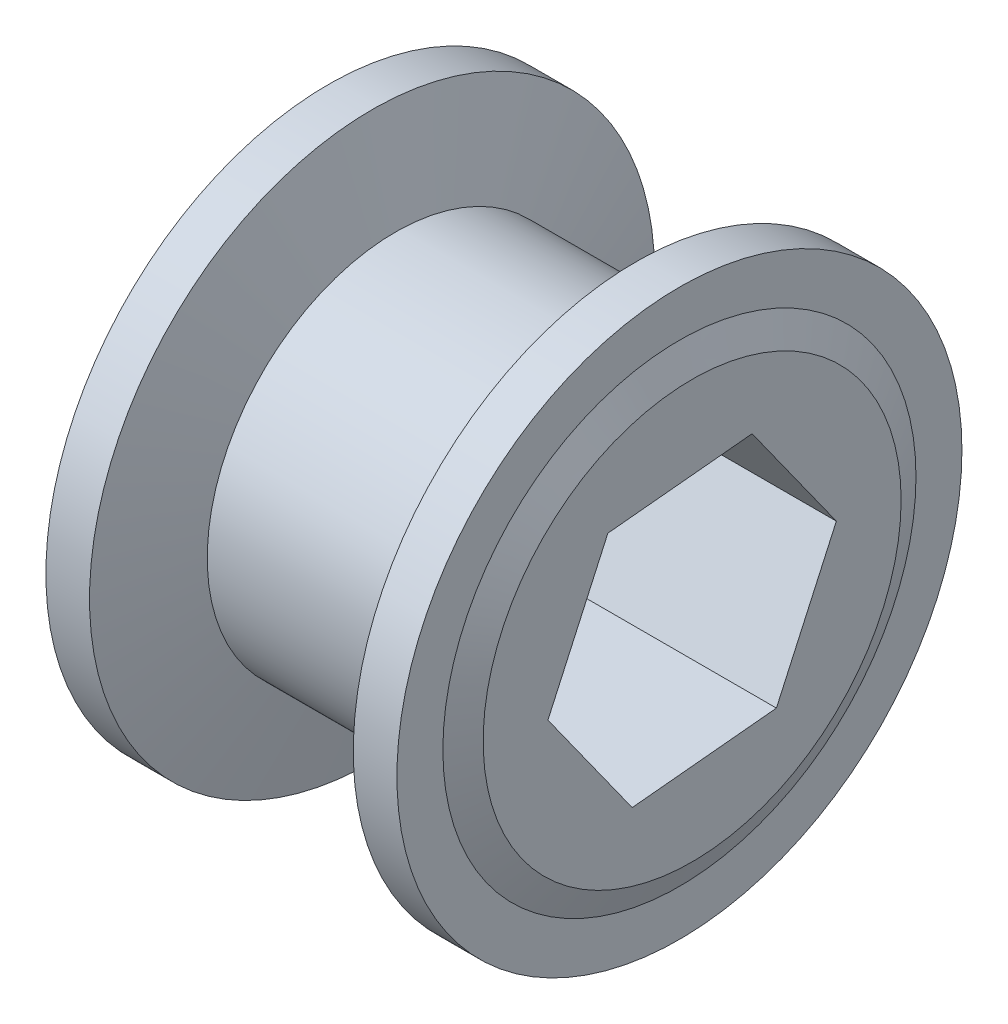
ISO-10303-21;
HEADER;
FILE_DESCRIPTION(('STEP AP214'),'2;1');
FILE_NAME('part.step','',(''),(''),'','','');
FILE_SCHEMA(('AUTOMOTIVE_DESIGN { 1 0 10303 214 1 1 1 1 }'));
ENDSEC;
DATA;
#1=APPLICATION_CONTEXT('core data for automotive mechanical design processes');
#2=APPLICATION_PROTOCOL_DEFINITION('international standard','automotive_design',2000,#1);
#3=PRODUCT_CONTEXT('',#1,'mechanical');
#4=PRODUCT('Part','Part','',(#3));
#5=PRODUCT_RELATED_PRODUCT_CATEGORY('part','',(#4));
#6=PRODUCT_DEFINITION_FORMATION('','',#4);
#7=PRODUCT_DEFINITION_CONTEXT('part definition',#1,'design');
#8=PRODUCT_DEFINITION('design','',#6,#7);
#9=PRODUCT_DEFINITION_SHAPE('','',#8);
#10=(LENGTH_UNIT() NAMED_UNIT(*) SI_UNIT(.MILLI.,.METRE.));
#11=(NAMED_UNIT(*) PLANE_ANGLE_UNIT() SI_UNIT($,.RADIAN.));
#12=(NAMED_UNIT(*) SI_UNIT($,.STERADIAN.) SOLID_ANGLE_UNIT());
#13=UNCERTAINTY_MEASURE_WITH_UNIT(LENGTH_MEASURE(1.E-05),#10,'distance_accuracy_value','');
#14=(GEOMETRIC_REPRESENTATION_CONTEXT(3) GLOBAL_UNCERTAINTY_ASSIGNED_CONTEXT((#13)) GLOBAL_UNIT_ASSIGNED_CONTEXT((#10,
#11,#12)) REPRESENTATION_CONTEXT('',''));
#15=CARTESIAN_POINT('',(0.,0.,0.));
#16=DIRECTION('',(0.,0.,1.));
#17=DIRECTION('',(1.,0.,0.));
#18=AXIS2_PLACEMENT_3D('',#15,#16,#17);
#19=CARTESIAN_POINT('',(14.1606713050093,0.,0.));
#20=DIRECTION('',(1.,0.,0.));
#21=DIRECTION('',(0.,0.,-1.));
#22=AXIS2_PLACEMENT_3D('',#19,#20,#21);
#23=CYLINDRICAL_SURFACE('',#22,9.525);
#24=CARTESIAN_POINT('',(5.48780048814024,0.,0.));
#25=DIRECTION('',(1.,0.,0.));
#26=DIRECTION('',(0.,0.,-1.));
#27=AXIS2_PLACEMENT_3D('',#24,#25,#26);
#28=CIRCLE('',#27,9.525);
#29=CARTESIAN_POINT('',(5.48780048814024,0.,-9.525));
#30=VERTEX_POINT('',#29);
#31=EDGE_CURVE('E132',#30,#30,#28,.T.);
#32=ORIENTED_EDGE('',*,*,#31,.F.);
#33=EDGE_LOOP('',(#32));
#34=FACE_BOUND('',#33,.T.);
#35=CARTESIAN_POINT('',(-5.48780048814024,0.,0.));
#36=DIRECTION('',(1.,0.,0.));
#37=DIRECTION('',(0.,0.,-1.));
#38=AXIS2_PLACEMENT_3D('',#35,#36,#37);
#39=CIRCLE('',#38,9.525);
#40=CARTESIAN_POINT('',(-5.48780048814024,0.,-9.525));
#41=VERTEX_POINT('',#40);
#42=EDGE_CURVE('E11',#41,#41,#39,.T.);
#43=ORIENTED_EDGE('',*,*,#42,.T.);
#44=EDGE_LOOP('',(#43));
#45=FACE_BOUND('',#44,.T.);
#46=ADVANCED_FACE('F35',(#34,#45),#23,.T.);
#47=CARTESIAN_POINT('',(-5.48780048814024,0.,0.));
#48=DIRECTION('',(-1.,0.,0.));
#49=DIRECTION('',(0.,0.,1.));
#50=AXIS2_PLACEMENT_3D('',#47,#48,#49);
#51=CONICAL_SURFACE('',#50,9.525,1.32724902649702);
#52=CARTESIAN_POINT('',(-6.6734296232301,0.,0.));
#53=DIRECTION('',(1.,0.,0.));
#54=DIRECTION('',(0.,0.,-1.));
#55=AXIS2_PLACEMENT_3D('',#52,#53,#54);
#56=CIRCLE('',#55,14.2965328044227);
#57=CARTESIAN_POINT('',(-6.6734296232301,0.,-14.2965328044227));
#58=VERTEX_POINT('',#57);
#59=EDGE_CURVE('E42',#58,#58,#56,.T.);
#60=ORIENTED_EDGE('',*,*,#59,.T.);
#61=EDGE_LOOP('',(#60));
#62=FACE_BOUND('',#61,.T.);
#63=ORIENTED_EDGE('',*,*,#42,.F.);
#64=EDGE_LOOP('',(#63));
#65=FACE_BOUND('',#64,.T.);
#66=ADVANCED_FACE('F165',(#62,#65),#51,.T.);
#67=CARTESIAN_POINT('',(14.1606713050093,0.,0.));
#68=DIRECTION('',(1.,0.,0.));
#69=DIRECTION('',(0.,0.,-1.));
#70=AXIS2_PLACEMENT_3D('',#67,#68,#69);
#71=CYLINDRICAL_SURFACE('',#70,14.2965328044227);
#72=CARTESIAN_POINT('',(-8.88177466157458,0.,0.));
#73=DIRECTION('',(1.,0.,0.));
#74=DIRECTION('',(0.,0.,-1.));
#75=AXIS2_PLACEMENT_3D('',#72,#73,#74);
#76=CIRCLE('',#75,14.2965328044227);
#77=CARTESIAN_POINT('',(-8.88177466157458,0.,-14.2965328044227));
#78=VERTEX_POINT('',#77);
#79=EDGE_CURVE('E160',#78,#78,#76,.T.);
#80=ORIENTED_EDGE('',*,*,#79,.T.);
#81=EDGE_LOOP('',(#80));
#82=FACE_BOUND('',#81,.T.);
#83=ORIENTED_EDGE('',*,*,#59,.F.);
#84=EDGE_LOOP('',(#83));
#85=FACE_BOUND('',#84,.T.);
#86=ADVANCED_FACE('F168',(#82,#85),#71,.T.);
#87=CARTESIAN_POINT('',(-8.88177466157458,0.,0.));
#88=DIRECTION('',(-1.,0.,0.));
#89=DIRECTION('',(0.,0.,1.));
#90=AXIS2_PLACEMENT_3D('',#87,#88,#89);
#91=PLANE('',#90);
#92=CARTESIAN_POINT('',(-8.88177466157458,0.,0.));
#93=DIRECTION('',(1.,0.,0.));
#94=DIRECTION('',(0.,0.,-1.));
#95=AXIS2_PLACEMENT_3D('',#92,#93,#94);
#96=CIRCLE('',#95,11.9707329902199);
#97=CARTESIAN_POINT('',(-8.88177466157458,0.,-11.9707329902199));
#98=VERTEX_POINT('',#97);
#99=EDGE_CURVE('E157',#98,#98,#96,.T.);
#100=ORIENTED_EDGE('',*,*,#99,.T.);
#101=EDGE_LOOP('',(#100));
#102=FACE_BOUND('',#101,.T.);
#103=ORIENTED_EDGE('',*,*,#79,.F.);
#104=EDGE_LOOP('',(#103));
#105=FACE_BOUND('',#104,.T.);
#106=ADVANCED_FACE('F170',(#102,#105),#91,.T.);
#107=CARTESIAN_POINT('',(-8.88177466157458,0.,0.));
#108=DIRECTION('',(1.,0.,0.));
#109=DIRECTION('',(0.,0.,-1.));
#110=AXIS2_PLACEMENT_3D('',#107,#108,#109);
#111=CONICAL_SURFACE('',#110,11.9707329902199,1.13884824811822);
#112=CARTESIAN_POINT('',(-9.525,0.,0.));
#113=DIRECTION('',(1.,0.,0.));
#114=DIRECTION('',(0.,0.,-1.));
#115=AXIS2_PLACEMENT_3D('',#112,#113,#114);
#116=CIRCLE('',#115,10.5753926286241);
#117=CARTESIAN_POINT('',(-9.525,0.,-10.5753926286241));
#118=VERTEX_POINT('',#117);
#119=EDGE_CURVE('E154',#118,#118,#116,.T.);
#120=ORIENTED_EDGE('',*,*,#119,.T.);
#121=EDGE_LOOP('',(#120));
#122=FACE_BOUND('',#121,.T.);
#123=ORIENTED_EDGE('',*,*,#99,.F.);
#124=EDGE_LOOP('',(#123));
#125=FACE_BOUND('',#124,.T.);
#126=ADVANCED_FACE('F177',(#122,#125),#111,.T.);
#127=CARTESIAN_POINT('',(-9.525,0.,0.));
#128=DIRECTION('',(-1.,0.,0.));
#129=DIRECTION('',(0.,0.,1.));
#130=AXIS2_PLACEMENT_3D('',#127,#128,#129);
#131=PLANE('',#130);
#132=DIRECTION('',(0.,0.0969196765193693,-0.995292206491833));
#133=VECTOR('',#132,1.);
#134=CARTESIAN_POINT('',(-9.525,-6.67542992965739,3.03347467231352));
#135=LINE('',#134,#133);
#136=CARTESIAN_POINT('',(-9.525,-6.67542992965739,3.03347467231352));
#137=VERTEX_POINT('',#136);
#138=CARTESIAN_POINT('',(-9.525,-5.96478109278888,-4.26435456410951));
#139=VERTEX_POINT('',#138);
#140=EDGE_CURVE('E89',#137,#139,#135,.T.);
#141=ORIENTED_EDGE('',*,*,#140,.T.);
#142=DIRECTION('',(0.,0.910408173270279,-0.413711201253572));
#143=VECTOR('',#142,1.);
#144=CARTESIAN_POINT('',(-9.525,-5.96478109278888,-4.26435456410951));
#145=LINE('',#144,#143);
#146=CARTESIAN_POINT('',(-9.525,0.710648836868518,-7.29782923642303));
#147=VERTEX_POINT('',#146);
#148=EDGE_CURVE('E98',#139,#147,#145,.T.);
#149=ORIENTED_EDGE('',*,*,#148,.T.);
#150=DIRECTION('',(0.,0.81348849675091,0.58158100523826));
#151=VECTOR('',#150,1.);
#152=CARTESIAN_POINT('',(-9.525,0.710648836868518,-7.29782923642303));
#153=LINE('',#152,#151);
#154=CARTESIAN_POINT('',(-9.525,6.6754299296574,-3.03347467231352));
#155=VERTEX_POINT('',#154);
#156=EDGE_CURVE('E49',#147,#155,#153,.T.);
#157=ORIENTED_EDGE('',*,*,#156,.T.);
#158=DIRECTION('',(0.,-0.0969196765193695,0.995292206491833));
#159=VECTOR('',#158,1.);
#160=CARTESIAN_POINT('',(-9.525,6.6754299296574,-3.03347467231352));
#161=LINE('',#160,#159);
#162=CARTESIAN_POINT('',(-9.525,5.96478109278888,4.26435456410951));
#163=VERTEX_POINT('',#162);
#164=EDGE_CURVE('E113',#155,#163,#161,.T.);
#165=ORIENTED_EDGE('',*,*,#164,.T.);
#166=DIRECTION('',(0.,-0.910408173270279,0.413711201253572));
#167=VECTOR('',#166,1.);
#168=CARTESIAN_POINT('',(-9.525,5.96478109278888,4.26435456410951));
#169=LINE('',#168,#167);
#170=CARTESIAN_POINT('',(-9.525,-0.710648836868512,7.29782923642303));
#171=VERTEX_POINT('',#170);
#172=EDGE_CURVE('E116',#163,#171,#169,.T.);
#173=ORIENTED_EDGE('',*,*,#172,.T.);
#174=DIRECTION('',(0.,-0.81348849675091,-0.58158100523826));
#175=VECTOR('',#174,1.);
#176=CARTESIAN_POINT('',(-9.525,-0.710648836868512,7.29782923642303));
#177=LINE('',#176,#175);
#178=EDGE_CURVE('E95',#171,#137,#177,.T.);
#179=ORIENTED_EDGE('',*,*,#178,.T.);
#180=EDGE_LOOP('',(#141,#149,#157,#165,#173,#179));
#181=FACE_BOUND('',#180,.T.);
#182=ORIENTED_EDGE('',*,*,#119,.F.);
#183=EDGE_LOOP('',(#182));
#184=FACE_BOUND('',#183,.T.);
#185=ADVANCED_FACE('F102',(#181,#184),#131,.T.);
#186=CARTESIAN_POINT('',(9.525,0.,0.));
#187=DIRECTION('',(-1.,0.,0.));
#188=DIRECTION('',(0.,0.,1.));
#189=AXIS2_PLACEMENT_3D('',#186,#187,#188);
#190=PLANE('',#189);
#191=DIRECTION('',(0.,0.910408173270279,-0.413711201253572));
#192=VECTOR('',#191,1.);
#193=CARTESIAN_POINT('',(9.525,-5.96478109278888,-4.26435456410951));
#194=LINE('',#193,#192);
#195=CARTESIAN_POINT('',(9.525,-5.96478109278888,-4.26435456410951));
#196=VERTEX_POINT('',#195);
#197=CARTESIAN_POINT('',(9.525,0.710648836868518,-7.29782923642303));
#198=VERTEX_POINT('',#197);
#199=EDGE_CURVE('E120',#196,#198,#194,.T.);
#200=ORIENTED_EDGE('',*,*,#199,.F.);
#201=DIRECTION('',(0.,0.0969196765193693,-0.995292206491833));
#202=VECTOR('',#201,1.);
#203=CARTESIAN_POINT('',(9.525,-6.67542992965739,3.03347467231352));
#204=LINE('',#203,#202);
#205=CARTESIAN_POINT('',(9.525,-6.67542992965739,3.03347467231352));
#206=VERTEX_POINT('',#205);
#207=EDGE_CURVE('E57',#206,#196,#204,.T.);
#208=ORIENTED_EDGE('',*,*,#207,.F.);
#209=DIRECTION('',(0.,-0.81348849675091,-0.58158100523826));
#210=VECTOR('',#209,1.);
#211=CARTESIAN_POINT('',(9.525,-0.710648836868512,7.29782923642303));
#212=LINE('',#211,#210);
#213=CARTESIAN_POINT('',(9.525,-0.710648836868512,7.29782923642303));
#214=VERTEX_POINT('',#213);
#215=EDGE_CURVE('E106',#214,#206,#212,.T.);
#216=ORIENTED_EDGE('',*,*,#215,.F.);
#217=DIRECTION('',(0.,-0.910408173270279,0.413711201253572));
#218=VECTOR('',#217,1.);
#219=CARTESIAN_POINT('',(9.525,5.96478109278888,4.26435456410951));
#220=LINE('',#219,#218);
#221=CARTESIAN_POINT('',(9.525,5.96478109278888,4.26435456410951));
#222=VERTEX_POINT('',#221);
#223=EDGE_CURVE('E109',#222,#214,#220,.T.);
#224=ORIENTED_EDGE('',*,*,#223,.F.);
#225=DIRECTION('',(0.,-0.0969196765193695,0.995292206491833));
#226=VECTOR('',#225,1.);
#227=CARTESIAN_POINT('',(9.525,6.6754299296574,-3.03347467231352));
#228=LINE('',#227,#226);
#229=CARTESIAN_POINT('',(9.525,6.6754299296574,-3.03347467231352));
#230=VERTEX_POINT('',#229);
#231=EDGE_CURVE('E125',#230,#222,#228,.T.);
#232=ORIENTED_EDGE('',*,*,#231,.F.);
#233=DIRECTION('',(0.,0.81348849675091,0.58158100523826));
#234=VECTOR('',#233,1.);
#235=CARTESIAN_POINT('',(9.525,0.710648836868518,-7.29782923642303));
#236=LINE('',#235,#234);
#237=EDGE_CURVE('E122',#198,#230,#236,.T.);
#238=ORIENTED_EDGE('',*,*,#237,.F.);
#239=EDGE_LOOP('',(#200,#208,#216,#224,#232,#238));
#240=FACE_BOUND('',#239,.T.);
#241=CARTESIAN_POINT('',(9.525,0.,0.));
#242=DIRECTION('',(1.,0.,0.));
#243=DIRECTION('',(0.,0.,-1.));
#244=AXIS2_PLACEMENT_3D('',#241,#242,#243);
#245=CIRCLE('',#244,10.5753926286241);
#246=CARTESIAN_POINT('',(9.525,0.,-10.5753926286241));
#247=VERTEX_POINT('',#246);
#248=EDGE_CURVE('E151',#247,#247,#245,.T.);
#249=ORIENTED_EDGE('',*,*,#248,.T.);
#250=EDGE_LOOP('',(#249));
#251=FACE_BOUND('',#250,.T.);
#252=ADVANCED_FACE('F211',(#240,#251),#190,.F.);
#253=CARTESIAN_POINT('',(8.88177466157458,0.,0.));
#254=DIRECTION('',(-1.,0.,0.));
#255=DIRECTION('',(0.,0.,1.));
#256=AXIS2_PLACEMENT_3D('',#253,#254,#255);
#257=CONICAL_SURFACE('',#256,11.9707329902199,1.13884824811822);
#258=ORIENTED_EDGE('',*,*,#248,.F.);
#259=EDGE_LOOP('',(#258));
#260=FACE_BOUND('',#259,.T.);
#261=CARTESIAN_POINT('',(8.88177466157458,0.,0.));
#262=DIRECTION('',(1.,0.,0.));
#263=DIRECTION('',(0.,0.,-1.));
#264=AXIS2_PLACEMENT_3D('',#261,#262,#263);
#265=CIRCLE('',#264,11.9707329902199);
#266=CARTESIAN_POINT('',(8.88177466157458,0.,-11.9707329902199));
#267=VERTEX_POINT('',#266);
#268=EDGE_CURVE('E148',#267,#267,#265,.T.);
#269=ORIENTED_EDGE('',*,*,#268,.T.);
#270=EDGE_LOOP('',(#269));
#271=FACE_BOUND('',#270,.T.);
#272=ADVANCED_FACE('F207',(#260,#271),#257,.T.);
#273=CARTESIAN_POINT('',(8.88177466157458,0.,0.));
#274=DIRECTION('',(-1.,0.,0.));
#275=DIRECTION('',(0.,0.,1.));
#276=AXIS2_PLACEMENT_3D('',#273,#274,#275);
#277=PLANE('',#276);
#278=ORIENTED_EDGE('',*,*,#268,.F.);
#279=EDGE_LOOP('',(#278));
#280=FACE_BOUND('',#279,.T.);
#281=CARTESIAN_POINT('',(8.88177466157458,0.,0.));
#282=DIRECTION('',(1.,0.,0.));
#283=DIRECTION('',(0.,0.,-1.));
#284=AXIS2_PLACEMENT_3D('',#281,#282,#283);
#285=CIRCLE('',#284,14.2965328044227);
#286=CARTESIAN_POINT('',(8.88177466157458,0.,-14.2965328044227));
#287=VERTEX_POINT('',#286);
#288=EDGE_CURVE('E145',#287,#287,#285,.T.);
#289=ORIENTED_EDGE('',*,*,#288,.T.);
#290=EDGE_LOOP('',(#289));
#291=FACE_BOUND('',#290,.T.);
#292=ADVANCED_FACE('F199',(#280,#291),#277,.F.);
#293=CARTESIAN_POINT('',(14.1606713050093,0.,0.));
#294=DIRECTION('',(1.,0.,0.));
#295=DIRECTION('',(0.,0.,-1.));
#296=AXIS2_PLACEMENT_3D('',#293,#294,#295);
#297=CYLINDRICAL_SURFACE('',#296,14.2965328044227);
#298=ORIENTED_EDGE('',*,*,#288,.F.);
#299=EDGE_LOOP('',(#298));
#300=FACE_BOUND('',#299,.T.);
#301=CARTESIAN_POINT('',(6.6734296232301,0.,0.));
#302=DIRECTION('',(1.,0.,0.));
#303=DIRECTION('',(0.,0.,-1.));
#304=AXIS2_PLACEMENT_3D('',#301,#302,#303);
#305=CIRCLE('',#304,14.2965328044227);
#306=CARTESIAN_POINT('',(6.6734296232301,0.,-14.2965328044227));
#307=VERTEX_POINT('',#306);
#308=EDGE_CURVE('E142',#307,#307,#305,.T.);
#309=ORIENTED_EDGE('',*,*,#308,.T.);
#310=EDGE_LOOP('',(#309));
#311=FACE_BOUND('',#310,.T.);
#312=ADVANCED_FACE('F190',(#300,#311),#297,.T.);
#313=CARTESIAN_POINT('',(5.48780048814024,0.,0.));
#314=DIRECTION('',(1.,0.,0.));
#315=DIRECTION('',(0.,0.,-1.));
#316=AXIS2_PLACEMENT_3D('',#313,#314,#315);
#317=CONICAL_SURFACE('',#316,9.525,1.32724902649702);
#318=ORIENTED_EDGE('',*,*,#308,.F.);
#319=EDGE_LOOP('',(#318));
#320=FACE_BOUND('',#319,.T.);
#321=ORIENTED_EDGE('',*,*,#31,.T.);
#322=EDGE_LOOP('',(#321));
#323=FACE_BOUND('',#322,.T.);
#324=ADVANCED_FACE('F188',(#320,#323),#317,.T.);
#325=CARTESIAN_POINT('',(-9.525,-6.67542992965739,3.03347467231352));
#326=DIRECTION('',(0.,-0.995292206491833,-0.0969196765193693));
#327=DIRECTION('',(0.,0.0969196765193693,-0.995292206491833));
#328=AXIS2_PLACEMENT_3D('',#325,#326,#327);
#329=PLANE('',#328);
#330=ORIENTED_EDGE('',*,*,#207,.T.);
#331=DIRECTION('',(1.,0.,0.));
#332=VECTOR('',#331,1.);
#333=CARTESIAN_POINT('',(-9.525,-5.96478109278888,-4.26435456410951));
#334=LINE('',#333,#332);
#335=EDGE_CURVE('E85',#139,#196,#334,.T.);
#336=ORIENTED_EDGE('',*,*,#335,.F.);
#337=ORIENTED_EDGE('',*,*,#140,.F.);
#338=DIRECTION('',(1.,0.,0.));
#339=VECTOR('',#338,1.);
#340=CARTESIAN_POINT('',(-9.525,-6.67542992965739,3.03347467231352));
#341=LINE('',#340,#339);
#342=EDGE_CURVE('E130',#137,#206,#341,.T.);
#343=ORIENTED_EDGE('',*,*,#342,.T.);
#344=EDGE_LOOP('',(#330,#336,#337,#343));
#345=FACE_BOUND('',#344,.T.);
#346=ADVANCED_FACE('F87',(#345),#329,.F.);
#347=CARTESIAN_POINT('',(-9.525,-0.710648836868512,7.29782923642303));
#348=DIRECTION('',(0.,-0.58158100523826,0.81348849675091));
#349=DIRECTION('',(0.,-0.81348849675091,-0.58158100523826));
#350=AXIS2_PLACEMENT_3D('',#347,#348,#349);
#351=PLANE('',#350);
#352=ORIENTED_EDGE('',*,*,#215,.T.);
#353=ORIENTED_EDGE('',*,*,#342,.F.);
#354=ORIENTED_EDGE('',*,*,#178,.F.);
#355=DIRECTION('',(1.,0.,0.));
#356=VECTOR('',#355,1.);
#357=CARTESIAN_POINT('',(-9.525,-0.710648836868512,7.29782923642303));
#358=LINE('',#357,#356);
#359=EDGE_CURVE('E133',#171,#214,#358,.T.);
#360=ORIENTED_EDGE('',*,*,#359,.T.);
#361=EDGE_LOOP('',(#352,#353,#354,#360));
#362=FACE_BOUND('',#361,.T.);
#363=ADVANCED_FACE('F197',(#362),#351,.F.);
#364=CARTESIAN_POINT('',(-9.525,5.96478109278888,4.26435456410951));
#365=DIRECTION('',(0.,0.413711201253572,0.910408173270279));
#366=DIRECTION('',(0.,-0.910408173270279,0.413711201253572));
#367=AXIS2_PLACEMENT_3D('',#364,#365,#366);
#368=PLANE('',#367);
#369=ORIENTED_EDGE('',*,*,#223,.T.);
#370=ORIENTED_EDGE('',*,*,#359,.F.);
#371=ORIENTED_EDGE('',*,*,#172,.F.);
#372=DIRECTION('',(1.,0.,0.));
#373=VECTOR('',#372,1.);
#374=CARTESIAN_POINT('',(-9.525,5.96478109278888,4.26435456410951));
#375=LINE('',#374,#373);
#376=EDGE_CURVE('E135',#163,#222,#375,.T.);
#377=ORIENTED_EDGE('',*,*,#376,.T.);
#378=EDGE_LOOP('',(#369,#370,#371,#377));
#379=FACE_BOUND('',#378,.T.);
#380=ADVANCED_FACE('F268',(#379),#368,.F.);
#381=CARTESIAN_POINT('',(-9.525,6.6754299296574,-3.03347467231352));
#382=DIRECTION('',(0.,0.995292206491833,0.0969196765193695));
#383=DIRECTION('',(0.,-0.0969196765193695,0.995292206491833));
#384=AXIS2_PLACEMENT_3D('',#381,#382,#383);
#385=PLANE('',#384);
#386=ORIENTED_EDGE('',*,*,#231,.T.);
#387=ORIENTED_EDGE('',*,*,#376,.F.);
#388=ORIENTED_EDGE('',*,*,#164,.F.);
#389=DIRECTION('',(1.,0.,0.));
#390=VECTOR('',#389,1.);
#391=CARTESIAN_POINT('',(-9.525,6.6754299296574,-3.03347467231352));
#392=LINE('',#391,#390);
#393=EDGE_CURVE('E137',#155,#230,#392,.T.);
#394=ORIENTED_EDGE('',*,*,#393,.T.);
#395=EDGE_LOOP('',(#386,#387,#388,#394));
#396=FACE_BOUND('',#395,.T.);
#397=ADVANCED_FACE('F277',(#396),#385,.F.);
#398=CARTESIAN_POINT('',(-9.525,0.710648836868518,-7.29782923642303));
#399=DIRECTION('',(0.,0.58158100523826,-0.81348849675091));
#400=DIRECTION('',(0.,0.81348849675091,0.58158100523826));
#401=AXIS2_PLACEMENT_3D('',#398,#399,#400);
#402=PLANE('',#401);
#403=ORIENTED_EDGE('',*,*,#237,.T.);
#404=ORIENTED_EDGE('',*,*,#393,.F.);
#405=ORIENTED_EDGE('',*,*,#156,.F.);
#406=DIRECTION('',(1.,0.,0.));
#407=VECTOR('',#406,1.);
#408=CARTESIAN_POINT('',(-9.525,0.710648836868518,-7.29782923642303));
#409=LINE('',#408,#407);
#410=EDGE_CURVE('E94',#147,#198,#409,.T.);
#411=ORIENTED_EDGE('',*,*,#410,.T.);
#412=EDGE_LOOP('',(#403,#404,#405,#411));
#413=FACE_BOUND('',#412,.T.);
#414=ADVANCED_FACE('F286',(#413),#402,.F.);
#415=CARTESIAN_POINT('',(-9.525,-5.96478109278888,-4.26435456410951));
#416=DIRECTION('',(0.,-0.413711201253572,-0.910408173270279));
#417=DIRECTION('',(0.,0.910408173270279,-0.413711201253572));
#418=AXIS2_PLACEMENT_3D('',#415,#416,#417);
#419=PLANE('',#418);
#420=ORIENTED_EDGE('',*,*,#199,.T.);
#421=ORIENTED_EDGE('',*,*,#410,.F.);
#422=ORIENTED_EDGE('',*,*,#148,.F.);
#423=ORIENTED_EDGE('',*,*,#335,.T.);
#424=EDGE_LOOP('',(#420,#421,#422,#423));
#425=FACE_BOUND('',#424,.T.);
#426=ADVANCED_FACE('F99',(#425),#419,.F.);
#427=CLOSED_SHELL('',(#46,#66,#86,#106,#126,#185,#252,#272,#292,#312,#324,#346,#363,#380,#397,
#414,#426));
#428=MANIFOLD_SOLID_BREP('B2',#427);
#429=ADVANCED_BREP_SHAPE_REPRESENTATION('',(#18,#428),#14);
#430=SHAPE_DEFINITION_REPRESENTATION(#9,#429);
ENDSEC;
END-ISO-10303-21;
